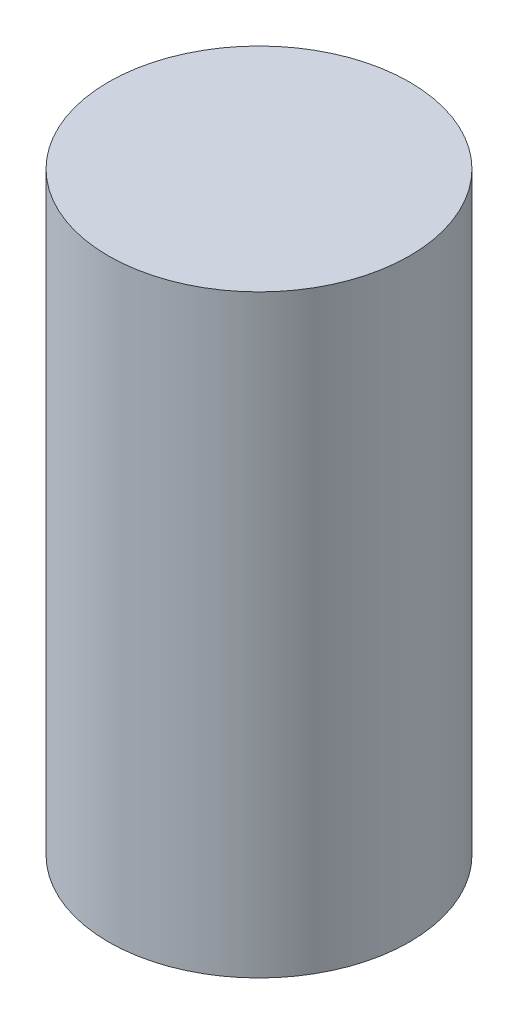
ISO-10303-21;
HEADER;
FILE_DESCRIPTION(('STEP AP214'),'2;1');
FILE_NAME('part.step','',(''),(''),'','','');
FILE_SCHEMA(('AUTOMOTIVE_DESIGN { 1 0 10303 214 1 1 1 1 }'));
ENDSEC;
DATA;
#1=APPLICATION_CONTEXT('core data for automotive mechanical design processes');
#2=APPLICATION_PROTOCOL_DEFINITION('international standard','automotive_design',2000,#1);
#3=PRODUCT_CONTEXT('',#1,'mechanical');
#4=PRODUCT('Part','Part','',(#3));
#5=PRODUCT_RELATED_PRODUCT_CATEGORY('part','',(#4));
#6=PRODUCT_DEFINITION_FORMATION('','',#4);
#7=PRODUCT_DEFINITION_CONTEXT('part definition',#1,'design');
#8=PRODUCT_DEFINITION('design','',#6,#7);
#9=PRODUCT_DEFINITION_SHAPE('','',#8);
#10=(LENGTH_UNIT() NAMED_UNIT(*) SI_UNIT(.MILLI.,.METRE.));
#11=(NAMED_UNIT(*) PLANE_ANGLE_UNIT() SI_UNIT($,.RADIAN.));
#12=(NAMED_UNIT(*) SI_UNIT($,.STERADIAN.) SOLID_ANGLE_UNIT());
#13=UNCERTAINTY_MEASURE_WITH_UNIT(LENGTH_MEASURE(1.E-05),#10,'distance_accuracy_value','');
#14=(GEOMETRIC_REPRESENTATION_CONTEXT(3) GLOBAL_UNCERTAINTY_ASSIGNED_CONTEXT((#13)) GLOBAL_UNIT_ASSIGNED_CONTEXT((#10,
#11,#12)) REPRESENTATION_CONTEXT('',''));
#15=CARTESIAN_POINT('',(0.,0.,0.));
#16=DIRECTION('',(0.,0.,1.));
#17=DIRECTION('',(1.,0.,0.));
#18=AXIS2_PLACEMENT_3D('',#15,#16,#17);
#19=CARTESIAN_POINT('',(0.,21.7,0.));
#20=DIRECTION('',(0.,-1.,0.));
#21=DIRECTION('',(0.,0.,-1.));
#22=AXIS2_PLACEMENT_3D('',#19,#20,#21);
#23=CYLINDRICAL_SURFACE('',#22,5.5);
#24=CARTESIAN_POINT('',(0.,21.7,0.));
#25=DIRECTION('',(0.,1.,0.));
#26=DIRECTION('',(0.,0.,1.));
#27=AXIS2_PLACEMENT_3D('',#24,#25,#26);
#28=CIRCLE('',#27,5.5);
#29=CARTESIAN_POINT('',(0.,21.7,5.5));
#30=VERTEX_POINT('',#29);
#31=EDGE_CURVE('E10',#30,#30,#28,.T.);
#32=ORIENTED_EDGE('',*,*,#31,.F.);
#33=EDGE_LOOP('',(#32));
#34=FACE_BOUND('',#33,.T.);
#35=CARTESIAN_POINT('',(0.,0.,0.));
#36=DIRECTION('',(0.,1.,0.));
#37=DIRECTION('',(0.,0.,1.));
#38=AXIS2_PLACEMENT_3D('',#35,#36,#37);
#39=CIRCLE('',#38,5.5);
#40=CARTESIAN_POINT('',(0.,0.,5.5));
#41=VERTEX_POINT('',#40);
#42=EDGE_CURVE('E46',#41,#41,#39,.T.);
#43=ORIENTED_EDGE('',*,*,#42,.T.);
#44=EDGE_LOOP('',(#43));
#45=FACE_BOUND('',#44,.T.);
#46=ADVANCED_FACE('F43',(#34,#45),#23,.T.);
#47=CARTESIAN_POINT('',(0.,21.7,0.));
#48=DIRECTION('',(0.,1.,0.));
#49=DIRECTION('',(0.,0.,1.));
#50=AXIS2_PLACEMENT_3D('',#47,#48,#49);
#51=PLANE('',#50);
#52=ORIENTED_EDGE('',*,*,#31,.T.);
#53=EDGE_LOOP('',(#52));
#54=FACE_BOUND('',#53,.T.);
#55=ADVANCED_FACE('F60',(#54),#51,.T.);
#56=CARTESIAN_POINT('',(0.,0.,0.));
#57=DIRECTION('',(0.,1.,0.));
#58=DIRECTION('',(0.,0.,1.));
#59=AXIS2_PLACEMENT_3D('',#56,#57,#58);
#60=PLANE('',#59);
#61=ORIENTED_EDGE('',*,*,#42,.F.);
#62=EDGE_LOOP('',(#61));
#63=FACE_BOUND('',#62,.T.);
#64=ADVANCED_FACE('F58',(#63),#60,.F.);
#65=CLOSED_SHELL('',(#46,#55,#64));
#66=MANIFOLD_SOLID_BREP('B2',#65);
#67=ADVANCED_BREP_SHAPE_REPRESENTATION('',(#18,#66),#14);
#68=SHAPE_DEFINITION_REPRESENTATION(#9,#67);
ENDSEC;
END-ISO-10303-21;
